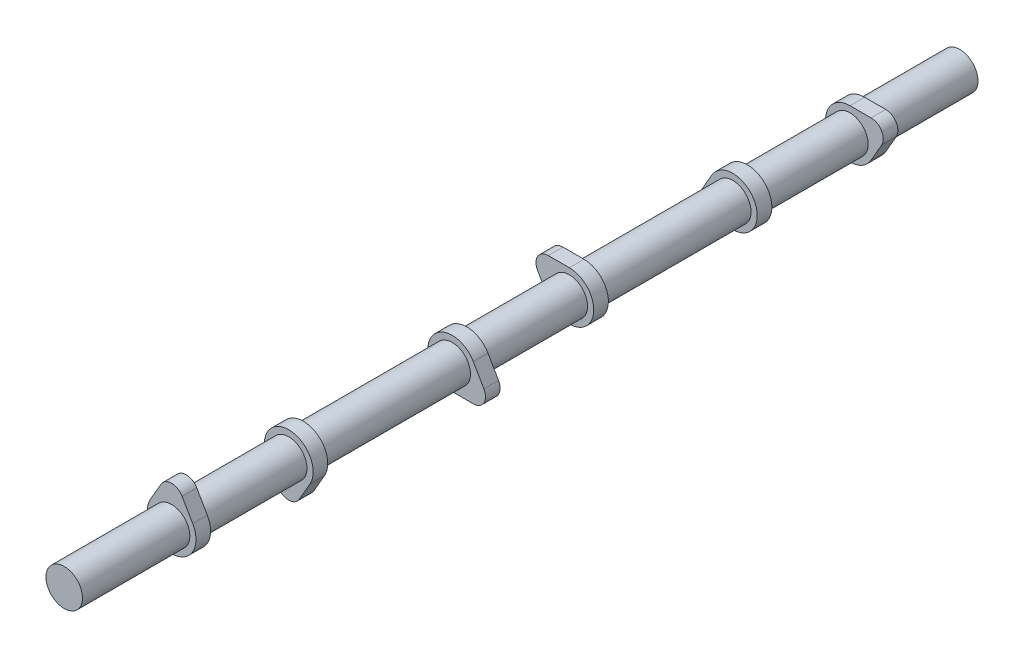
ISO-10303-21;
HEADER;
FILE_DESCRIPTION(('STEP AP214'),'2;1');
FILE_NAME('part.step','',(''),(''),'','','');
FILE_SCHEMA(('AUTOMOTIVE_DESIGN { 1 0 10303 214 1 1 1 1 }'));
ENDSEC;
DATA;
#1=APPLICATION_CONTEXT('core data for automotive mechanical design processes');
#2=APPLICATION_PROTOCOL_DEFINITION('international standard','automotive_design',2000,#1);
#3=PRODUCT_CONTEXT('',#1,'mechanical');
#4=PRODUCT('Part','Part','',(#3));
#5=PRODUCT_RELATED_PRODUCT_CATEGORY('part','',(#4));
#6=PRODUCT_DEFINITION_FORMATION('','',#4);
#7=PRODUCT_DEFINITION_CONTEXT('part definition',#1,'design');
#8=PRODUCT_DEFINITION('design','',#6,#7);
#9=PRODUCT_DEFINITION_SHAPE('','',#8);
#10=(LENGTH_UNIT() NAMED_UNIT(*) SI_UNIT(.MILLI.,.METRE.));
#11=(NAMED_UNIT(*) PLANE_ANGLE_UNIT() SI_UNIT($,.RADIAN.));
#12=(NAMED_UNIT(*) SI_UNIT($,.STERADIAN.) SOLID_ANGLE_UNIT());
#13=UNCERTAINTY_MEASURE_WITH_UNIT(LENGTH_MEASURE(1.E-05),#10,'distance_accuracy_value','');
#14=(GEOMETRIC_REPRESENTATION_CONTEXT(3) GLOBAL_UNCERTAINTY_ASSIGNED_CONTEXT((#13)) GLOBAL_UNIT_ASSIGNED_CONTEXT((#10,
#11,#12)) REPRESENTATION_CONTEXT('',''));
#15=CARTESIAN_POINT('',(0.,0.,0.));
#16=DIRECTION('',(0.,0.,1.));
#17=DIRECTION('',(1.,0.,0.));
#18=AXIS2_PLACEMENT_3D('',#15,#16,#17);
#19=CARTESIAN_POINT('',(0.,0.,-7.62));
#20=DIRECTION('',(0.,0.,1.));
#21=DIRECTION('',(1.,0.,0.));
#22=AXIS2_PLACEMENT_3D('',#19,#20,#21);
#23=CYLINDRICAL_SURFACE('',#22,12.7);
#24=CARTESIAN_POINT('',(0.,0.,0.));
#25=DIRECTION('',(0.,0.,1.));
#26=DIRECTION('',(1.,0.,0.));
#27=AXIS2_PLACEMENT_3D('',#24,#25,#26);
#28=CIRCLE('',#27,12.7);
#29=CARTESIAN_POINT('',(-10.9985226280624,6.35,0.));
#30=VERTEX_POINT('',#29);
#31=CARTESIAN_POINT('',(10.9985226280624,6.35,0.));
#32=VERTEX_POINT('',#31);
#33=EDGE_CURVE('E452',#30,#32,#28,.T.);
#34=ORIENTED_EDGE('',*,*,#33,.F.);
#35=DIRECTION('',(0.,0.,1.));
#36=VECTOR('',#35,1.);
#37=CARTESIAN_POINT('',(-10.9985226280624,6.35,-7.62));
#38=LINE('',#37,#36);
#39=CARTESIAN_POINT('',(-10.9985226280624,6.35,-7.62));
#40=VERTEX_POINT('',#39);
#41=EDGE_CURVE('E57',#40,#30,#38,.T.);
#42=ORIENTED_EDGE('',*,*,#41,.F.);
#43=CARTESIAN_POINT('',(0.,0.,-7.62));
#44=DIRECTION('',(0.,0.,1.));
#45=DIRECTION('',(1.,0.,0.));
#46=AXIS2_PLACEMENT_3D('',#43,#44,#45);
#47=CIRCLE('',#46,12.7);
#48=CARTESIAN_POINT('',(10.9985226280624,6.35,-7.62));
#49=VERTEX_POINT('',#48);
#50=EDGE_CURVE('E453',#40,#49,#47,.T.);
#51=ORIENTED_EDGE('',*,*,#50,.T.);
#52=DIRECTION('',(0.,0.,1.));
#53=VECTOR('',#52,1.);
#54=CARTESIAN_POINT('',(10.9985226280624,6.35,-7.62));
#55=LINE('',#54,#53);
#56=EDGE_CURVE('E86',#49,#32,#55,.T.);
#57=ORIENTED_EDGE('',*,*,#56,.T.);
#58=EDGE_LOOP('',(#34,#42,#51,#57));
#59=FACE_BOUND('',#58,.T.);
#60=ADVANCED_FACE('F39',(#59),#23,.T.);
#61=CARTESIAN_POINT('',(-10.9985226280624,6.35,-7.62));
#62=DIRECTION('',(0.866025403784439,-0.5,0.));
#63=DIRECTION('',(0.5,0.866025403784439,0.));
#64=AXIS2_PLACEMENT_3D('',#61,#62,#63);
#65=PLANE('',#64);
#66=DIRECTION('',(0.5,0.866025403784439,0.));
#67=VECTOR('',#66,1.);
#68=CARTESIAN_POINT('',(-10.9985226280624,6.35,0.));
#69=LINE('',#68,#67);
#70=CARTESIAN_POINT('',(-5.49926131403119,15.875,0.));
#71=VERTEX_POINT('',#70);
#72=EDGE_CURVE('E457',#30,#71,#69,.T.);
#73=ORIENTED_EDGE('',*,*,#72,.T.);
#74=DIRECTION('',(0.,0.,1.));
#75=VECTOR('',#74,1.);
#76=CARTESIAN_POINT('',(-5.49926131403119,15.875,-7.62));
#77=LINE('',#76,#75);
#78=CARTESIAN_POINT('',(-5.49926131403119,15.875,-7.62));
#79=VERTEX_POINT('',#78);
#80=EDGE_CURVE('E76',#79,#71,#77,.T.);
#81=ORIENTED_EDGE('',*,*,#80,.F.);
#82=DIRECTION('',(0.5,0.866025403784439,0.));
#83=VECTOR('',#82,1.);
#84=CARTESIAN_POINT('',(-10.9985226280624,6.35,-7.62));
#85=LINE('',#84,#83);
#86=EDGE_CURVE('E463',#40,#79,#85,.T.);
#87=ORIENTED_EDGE('',*,*,#86,.F.);
#88=ORIENTED_EDGE('',*,*,#41,.T.);
#89=EDGE_LOOP('',(#73,#81,#87,#88));
#90=FACE_BOUND('',#89,.T.);
#91=ADVANCED_FACE('F557',(#90),#65,.F.);
#92=CARTESIAN_POINT('',(0.,12.7,-7.62));
#93=DIRECTION('',(0.,0.,1.));
#94=DIRECTION('',(1.,0.,0.));
#95=AXIS2_PLACEMENT_3D('',#92,#93,#94);
#96=CYLINDRICAL_SURFACE('',#95,6.35);
#97=CARTESIAN_POINT('',(0.,12.7,0.));
#98=DIRECTION('',(0.,0.,1.));
#99=DIRECTION('',(1.,0.,0.));
#100=AXIS2_PLACEMENT_3D('',#97,#98,#99);
#101=CIRCLE('',#100,6.35);
#102=CARTESIAN_POINT('',(5.49926131403119,15.875,0.));
#103=VERTEX_POINT('',#102);
#104=EDGE_CURVE('E473',#103,#71,#101,.T.);
#105=ORIENTED_EDGE('',*,*,#104,.F.);
#106=DIRECTION('',(0.,0.,1.));
#107=VECTOR('',#106,1.);
#108=CARTESIAN_POINT('',(5.49926131403119,15.875,-7.62));
#109=LINE('',#108,#107);
#110=CARTESIAN_POINT('',(5.49926131403119,15.875,-7.62));
#111=VERTEX_POINT('',#110);
#112=EDGE_CURVE('E484',#111,#103,#109,.T.);
#113=ORIENTED_EDGE('',*,*,#112,.F.);
#114=CARTESIAN_POINT('',(0.,12.7,-7.62));
#115=DIRECTION('',(0.,0.,1.));
#116=DIRECTION('',(1.,0.,0.));
#117=AXIS2_PLACEMENT_3D('',#114,#115,#116);
#118=CIRCLE('',#117,6.35);
#119=EDGE_CURVE('E460',#111,#79,#118,.T.);
#120=ORIENTED_EDGE('',*,*,#119,.T.);
#121=ORIENTED_EDGE('',*,*,#80,.T.);
#122=EDGE_LOOP('',(#105,#113,#120,#121));
#123=FACE_BOUND('',#122,.T.);
#124=ADVANCED_FACE('F561',(#123),#96,.T.);
#125=CARTESIAN_POINT('',(10.9985226280624,6.35,-7.62));
#126=DIRECTION('',(0.866025403784439,0.5,0.));
#127=DIRECTION('',(-0.5,0.866025403784439,0.));
#128=AXIS2_PLACEMENT_3D('',#125,#126,#127);
#129=PLANE('',#128);
#130=DIRECTION('',(-0.5,0.866025403784439,0.));
#131=VECTOR('',#130,1.);
#132=CARTESIAN_POINT('',(10.9985226280624,6.35,0.));
#133=LINE('',#132,#131);
#134=EDGE_CURVE('E469',#32,#103,#133,.T.);
#135=ORIENTED_EDGE('',*,*,#134,.F.);
#136=ORIENTED_EDGE('',*,*,#56,.F.);
#137=DIRECTION('',(-0.5,0.866025403784439,0.));
#138=VECTOR('',#137,1.);
#139=CARTESIAN_POINT('',(10.9985226280624,6.35,-7.62));
#140=LINE('',#139,#138);
#141=EDGE_CURVE('E456',#49,#111,#140,.T.);
#142=ORIENTED_EDGE('',*,*,#141,.T.);
#143=ORIENTED_EDGE('',*,*,#112,.T.);
#144=EDGE_LOOP('',(#135,#136,#142,#143));
#145=FACE_BOUND('',#144,.T.);
#146=ADVANCED_FACE('F569',(#145),#129,.T.);
#147=CARTESIAN_POINT('',(0.,0.,-7.62));
#148=DIRECTION('',(0.,0.,1.));
#149=DIRECTION('',(1.,0.,0.));
#150=AXIS2_PLACEMENT_3D('',#147,#148,#149);
#151=PLANE('',#150);
#152=CARTESIAN_POINT('',(0.,0.,-7.62000000000002));
#153=DIRECTION('',(0.,0.,1.));
#154=DIRECTION('',(1.,0.,0.));
#155=AXIS2_PLACEMENT_3D('',#152,#153,#154);
#156=CIRCLE('',#155,9.5);
#157=CARTESIAN_POINT('',(9.5,0.,-7.62000000000002));
#158=VERTEX_POINT('',#157);
#159=EDGE_CURVE('E444',#158,#158,#156,.T.);
#160=ORIENTED_EDGE('',*,*,#159,.T.);
#161=EDGE_LOOP('',(#160));
#162=FACE_BOUND('',#161,.T.);
#163=ORIENTED_EDGE('',*,*,#50,.F.);
#164=ORIENTED_EDGE('',*,*,#86,.T.);
#165=ORIENTED_EDGE('',*,*,#119,.F.);
#166=ORIENTED_EDGE('',*,*,#141,.F.);
#167=EDGE_LOOP('',(#163,#164,#165,#166));
#168=FACE_BOUND('',#167,.T.);
#169=ADVANCED_FACE('F568',(#162,#168),#151,.F.);
#170=CARTESIAN_POINT('',(0.,0.,0.));
#171=DIRECTION('',(0.,0.,1.));
#172=DIRECTION('',(1.,0.,0.));
#173=AXIS2_PLACEMENT_3D('',#170,#171,#172);
#174=PLANE('',#173);
#175=CARTESIAN_POINT('',(0.,0.,0.));
#176=DIRECTION('',(0.,0.,1.));
#177=DIRECTION('',(1.,0.,0.));
#178=AXIS2_PLACEMENT_3D('',#175,#176,#177);
#179=CIRCLE('',#178,9.5);
#180=CARTESIAN_POINT('',(9.5,0.,0.));
#181=VERTEX_POINT('',#180);
#182=EDGE_CURVE('E481',#181,#181,#179,.T.);
#183=ORIENTED_EDGE('',*,*,#182,.F.);
#184=EDGE_LOOP('',(#183));
#185=FACE_BOUND('',#184,.T.);
#186=ORIENTED_EDGE('',*,*,#33,.T.);
#187=ORIENTED_EDGE('',*,*,#134,.T.);
#188=ORIENTED_EDGE('',*,*,#104,.T.);
#189=ORIENTED_EDGE('',*,*,#72,.F.);
#190=EDGE_LOOP('',(#186,#187,#188,#189));
#191=FACE_BOUND('',#190,.T.);
#192=ADVANCED_FACE('F564',(#185,#191),#174,.T.);
#193=CARTESIAN_POINT('',(0.,0.,55.88));
#194=DIRECTION('',(0.,0.,1.));
#195=DIRECTION('',(1.,0.,0.));
#196=AXIS2_PLACEMENT_3D('',#193,#194,#195);
#197=PLANE('',#196);
#198=CARTESIAN_POINT('',(0.,0.,55.88));
#199=DIRECTION('',(0.,0.,1.));
#200=DIRECTION('',(1.,0.,0.));
#201=AXIS2_PLACEMENT_3D('',#198,#199,#200);
#202=CIRCLE('',#201,9.5);
#203=CARTESIAN_POINT('',(9.5,0.,55.88));
#204=VERTEX_POINT('',#203);
#205=EDGE_CURVE('E445',#204,#204,#202,.T.);
#206=ORIENTED_EDGE('',*,*,#205,.T.);
#207=EDGE_LOOP('',(#206));
#208=FACE_BOUND('',#207,.T.);
#209=ADVANCED_FACE('F580',(#208),#197,.T.);
#210=CARTESIAN_POINT('',(0.,0.,-410.21));
#211=DIRECTION('',(0.,0.,1.));
#212=DIRECTION('',(1.,0.,0.));
#213=AXIS2_PLACEMENT_3D('',#210,#211,#212);
#214=CYLINDRICAL_SURFACE('',#213,9.5);
#215=ORIENTED_EDGE('',*,*,#182,.T.);
#216=EDGE_LOOP('',(#215));
#217=FACE_BOUND('',#216,.T.);
#218=ORIENTED_EDGE('',*,*,#205,.F.);
#219=EDGE_LOOP('',(#218));
#220=FACE_BOUND('',#219,.T.);
#221=ADVANCED_FACE('F582',(#217,#220),#214,.T.);
#222=CARTESIAN_POINT('',(0.,0.,-60.96));
#223=DIRECTION('',(0.,0.,1.));
#224=DIRECTION('',(1.,0.,0.));
#225=AXIS2_PLACEMENT_3D('',#222,#223,#224);
#226=CIRCLE('',#225,9.5);
#227=CARTESIAN_POINT('',(9.5,0.,-60.96));
#228=VERTEX_POINT('',#227);
#229=EDGE_CURVE('E492',#228,#228,#226,.F.);
#230=ORIENTED_EDGE('',*,*,#229,.F.);
#231=EDGE_LOOP('',(#230));
#232=FACE_BOUND('',#231,.T.);
#233=ORIENTED_EDGE('',*,*,#159,.F.);
#234=EDGE_LOOP('',(#233));
#235=FACE_BOUND('',#234,.T.);
#236=ADVANCED_FACE('F585',(#232,#235),#214,.T.);
#237=CARTESIAN_POINT('',(0.,0.,-68.58));
#238=DIRECTION('',(0.,0.,1.));
#239=DIRECTION('',(-1.,0.,0.));
#240=AXIS2_PLACEMENT_3D('',#237,#238,#239);
#241=CYLINDRICAL_SURFACE('',#240,12.7);
#242=CARTESIAN_POINT('',(0.,0.,-60.96));
#243=DIRECTION('',(0.,0.,1.));
#244=DIRECTION('',(-1.,0.,0.));
#245=AXIS2_PLACEMENT_3D('',#242,#243,#244);
#246=CIRCLE('',#245,12.7);
#247=CARTESIAN_POINT('',(10.9985226280624,-6.34999999999992,-60.96));
#248=VERTEX_POINT('',#247);
#249=CARTESIAN_POINT('',(-10.9985226280623,-6.35000000000008,-60.96));
#250=VERTEX_POINT('',#249);
#251=EDGE_CURVE('E413',#248,#250,#246,.T.);
#252=ORIENTED_EDGE('',*,*,#251,.F.);
#253=DIRECTION('',(0.,0.,1.));
#254=VECTOR('',#253,1.);
#255=CARTESIAN_POINT('',(10.9985226280624,-6.34999999999992,-68.58));
#256=LINE('',#255,#254);
#257=CARTESIAN_POINT('',(10.9985226280624,-6.34999999999992,-68.58));
#258=VERTEX_POINT('',#257);
#259=EDGE_CURVE('E428',#258,#248,#256,.T.);
#260=ORIENTED_EDGE('',*,*,#259,.F.);
#261=CARTESIAN_POINT('',(0.,0.,-68.58));
#262=DIRECTION('',(0.,0.,1.));
#263=DIRECTION('',(-1.,0.,0.));
#264=AXIS2_PLACEMENT_3D('',#261,#262,#263);
#265=CIRCLE('',#264,12.7);
#266=CARTESIAN_POINT('',(-10.9985226280623,-6.35000000000008,-68.58));
#267=VERTEX_POINT('',#266);
#268=EDGE_CURVE('E396',#258,#267,#265,.T.);
#269=ORIENTED_EDGE('',*,*,#268,.T.);
#270=DIRECTION('',(0.,0.,1.));
#271=VECTOR('',#270,1.);
#272=CARTESIAN_POINT('',(-10.9985226280623,-6.35000000000008,-68.58));
#273=LINE('',#272,#271);
#274=EDGE_CURVE('E412',#267,#250,#273,.T.);
#275=ORIENTED_EDGE('',*,*,#274,.T.);
#276=EDGE_LOOP('',(#252,#260,#269,#275));
#277=FACE_BOUND('',#276,.T.);
#278=ADVANCED_FACE('F595',(#277),#241,.T.);
#279=CARTESIAN_POINT('',(10.9985226280624,-6.34999999999992,-68.58));
#280=DIRECTION('',(-0.866025403784442,0.499999999999994,0.));
#281=DIRECTION('',(-0.499999999999994,-0.866025403784442,0.));
#282=AXIS2_PLACEMENT_3D('',#279,#280,#281);
#283=PLANE('',#282);
#284=DIRECTION('',(-0.499999999999994,-0.866025403784442,0.));
#285=VECTOR('',#284,1.);
#286=CARTESIAN_POINT('',(10.9985226280624,-6.34999999999992,-60.96));
#287=LINE('',#286,#285);
#288=CARTESIAN_POINT('',(5.4992613140313,-15.875,-60.96));
#289=VERTEX_POINT('',#288);
#290=EDGE_CURVE('E401',#248,#289,#287,.T.);
#291=ORIENTED_EDGE('',*,*,#290,.T.);
#292=DIRECTION('',(0.,0.,1.));
#293=VECTOR('',#292,1.);
#294=CARTESIAN_POINT('',(5.4992613140313,-15.875,-68.58));
#295=LINE('',#294,#293);
#296=CARTESIAN_POINT('',(5.4992613140313,-15.875,-68.58));
#297=VERTEX_POINT('',#296);
#298=EDGE_CURVE('E432',#297,#289,#295,.T.);
#299=ORIENTED_EDGE('',*,*,#298,.F.);
#300=DIRECTION('',(-0.499999999999994,-0.866025403784442,0.));
#301=VECTOR('',#300,1.);
#302=CARTESIAN_POINT('',(10.9985226280624,-6.34999999999992,-68.58));
#303=LINE('',#302,#301);
#304=EDGE_CURVE('E409',#258,#297,#303,.T.);
#305=ORIENTED_EDGE('',*,*,#304,.F.);
#306=ORIENTED_EDGE('',*,*,#259,.T.);
#307=EDGE_LOOP('',(#291,#299,#305,#306));
#308=FACE_BOUND('',#307,.T.);
#309=ADVANCED_FACE('F598',(#308),#283,.F.);
#310=CARTESIAN_POINT('',(0.,-12.7,-68.58));
#311=DIRECTION('',(0.,0.,1.));
#312=DIRECTION('',(-1.,0.,0.));
#313=AXIS2_PLACEMENT_3D('',#310,#311,#312);
#314=CYLINDRICAL_SURFACE('',#313,6.35);
#315=CARTESIAN_POINT('',(0.,-12.7,-60.96));
#316=DIRECTION('',(0.,0.,1.));
#317=DIRECTION('',(-1.,0.,0.));
#318=AXIS2_PLACEMENT_3D('',#315,#316,#317);
#319=CIRCLE('',#318,6.35);
#320=CARTESIAN_POINT('',(-5.49926131403107,-15.875,-60.96));
#321=VERTEX_POINT('',#320);
#322=EDGE_CURVE('E421',#321,#289,#319,.T.);
#323=ORIENTED_EDGE('',*,*,#322,.F.);
#324=DIRECTION('',(0.,0.,1.));
#325=VECTOR('',#324,1.);
#326=CARTESIAN_POINT('',(-5.49926131403107,-15.875,-68.58));
#327=LINE('',#326,#325);
#328=CARTESIAN_POINT('',(-5.49926131403107,-15.875,-68.58));
#329=VERTEX_POINT('',#328);
#330=EDGE_CURVE('E435',#329,#321,#327,.T.);
#331=ORIENTED_EDGE('',*,*,#330,.F.);
#332=CARTESIAN_POINT('',(0.,-12.7,-68.58));
#333=DIRECTION('',(0.,0.,1.));
#334=DIRECTION('',(-1.,0.,0.));
#335=AXIS2_PLACEMENT_3D('',#332,#333,#334);
#336=CIRCLE('',#335,6.35);
#337=EDGE_CURVE('E405',#329,#297,#336,.T.);
#338=ORIENTED_EDGE('',*,*,#337,.T.);
#339=ORIENTED_EDGE('',*,*,#298,.T.);
#340=EDGE_LOOP('',(#323,#331,#338,#339));
#341=FACE_BOUND('',#340,.T.);
#342=ADVANCED_FACE('F604',(#341),#314,.T.);
#343=CARTESIAN_POINT('',(-10.9985226280623,-6.35000000000008,-68.58));
#344=DIRECTION('',(-0.866025403784435,-0.500000000000006,0.));
#345=DIRECTION('',(0.500000000000006,-0.866025403784435,0.));
#346=AXIS2_PLACEMENT_3D('',#343,#344,#345);
#347=PLANE('',#346);
#348=DIRECTION('',(0.500000000000006,-0.866025403784435,0.));
#349=VECTOR('',#348,1.);
#350=CARTESIAN_POINT('',(-10.9985226280623,-6.35000000000008,-60.96));
#351=LINE('',#350,#349);
#352=EDGE_CURVE('E417',#250,#321,#351,.T.);
#353=ORIENTED_EDGE('',*,*,#352,.F.);
#354=ORIENTED_EDGE('',*,*,#274,.F.);
#355=DIRECTION('',(0.500000000000006,-0.866025403784435,0.));
#356=VECTOR('',#355,1.);
#357=CARTESIAN_POINT('',(-10.9985226280623,-6.35000000000008,-68.58));
#358=LINE('',#357,#356);
#359=EDGE_CURVE('E400',#267,#329,#358,.T.);
#360=ORIENTED_EDGE('',*,*,#359,.T.);
#361=ORIENTED_EDGE('',*,*,#330,.T.);
#362=EDGE_LOOP('',(#353,#354,#360,#361));
#363=FACE_BOUND('',#362,.T.);
#364=ADVANCED_FACE('F600',(#363),#347,.T.);
#365=CARTESIAN_POINT('',(0.,0.,-68.58));
#366=DIRECTION('',(0.,0.,1.));
#367=DIRECTION('',(-1.,0.,0.));
#368=AXIS2_PLACEMENT_3D('',#365,#366,#367);
#369=PLANE('',#368);
#370=CARTESIAN_POINT('',(0.,0.,-68.58));
#371=DIRECTION('',(0.,0.,1.));
#372=DIRECTION('',(1.,0.,0.));
#373=AXIS2_PLACEMENT_3D('',#370,#371,#372);
#374=CIRCLE('',#373,9.5);
#375=CARTESIAN_POINT('',(9.5,0.,-68.58));
#376=VERTEX_POINT('',#375);
#377=EDGE_CURVE('E431',#376,#376,#374,.F.);
#378=ORIENTED_EDGE('',*,*,#377,.F.);
#379=EDGE_LOOP('',(#378));
#380=FACE_BOUND('',#379,.T.);
#381=ORIENTED_EDGE('',*,*,#268,.F.);
#382=ORIENTED_EDGE('',*,*,#304,.T.);
#383=ORIENTED_EDGE('',*,*,#337,.F.);
#384=ORIENTED_EDGE('',*,*,#359,.F.);
#385=EDGE_LOOP('',(#381,#382,#383,#384));
#386=FACE_BOUND('',#385,.T.);
#387=ADVANCED_FACE('F603',(#380,#386),#369,.F.);
#388=CARTESIAN_POINT('',(0.,0.,-60.96));
#389=DIRECTION('',(0.,0.,1.));
#390=DIRECTION('',(-1.,0.,0.));
#391=AXIS2_PLACEMENT_3D('',#388,#389,#390);
#392=PLANE('',#391);
#393=ORIENTED_EDGE('',*,*,#229,.T.);
#394=EDGE_LOOP('',(#393));
#395=FACE_BOUND('',#394,.T.);
#396=ORIENTED_EDGE('',*,*,#251,.T.);
#397=ORIENTED_EDGE('',*,*,#352,.T.);
#398=ORIENTED_EDGE('',*,*,#322,.T.);
#399=ORIENTED_EDGE('',*,*,#290,.F.);
#400=EDGE_LOOP('',(#396,#397,#398,#399));
#401=FACE_BOUND('',#400,.T.);
#402=ADVANCED_FACE('F612',(#395,#401),#392,.T.);
#403=CARTESIAN_POINT('',(0.,0.,-146.05));
#404=DIRECTION('',(0.,0.,1.));
#405=DIRECTION('',(1.,0.,0.));
#406=AXIS2_PLACEMENT_3D('',#403,#404,#405);
#407=CIRCLE('',#406,9.5);
#408=CARTESIAN_POINT('',(9.5,0.,-146.05));
#409=VERTEX_POINT('',#408);
#410=EDGE_CURVE('E496',#409,#409,#407,.F.);
#411=ORIENTED_EDGE('',*,*,#410,.F.);
#412=EDGE_LOOP('',(#411));
#413=FACE_BOUND('',#412,.T.);
#414=ORIENTED_EDGE('',*,*,#377,.T.);
#415=EDGE_LOOP('',(#414));
#416=FACE_BOUND('',#415,.T.);
#417=ADVANCED_FACE('F615',(#413,#416),#214,.T.);
#418=CARTESIAN_POINT('',(0.,0.,-153.67));
#419=DIRECTION('',(0.,0.,1.));
#420=DIRECTION('',(-0.500000000000004,-0.866025403784436,0.));
#421=AXIS2_PLACEMENT_3D('',#418,#419,#420);
#422=CYLINDRICAL_SURFACE('',#421,12.7);
#423=CARTESIAN_POINT('',(0.,0.,-146.05));
#424=DIRECTION('',(0.,0.,1.));
#425=DIRECTION('',(-0.500000000000004,-0.866025403784436,0.));
#426=AXIS2_PLACEMENT_3D('',#423,#424,#425);
#427=CIRCLE('',#426,12.7);
#428=CARTESIAN_POINT('',(10.9985226280624,6.34999999999995,-146.05));
#429=VERTEX_POINT('',#428);
#430=CARTESIAN_POINT('',(0.,-12.7,-146.05));
#431=VERTEX_POINT('',#430);
#432=EDGE_CURVE('E369',#429,#431,#427,.T.);
#433=ORIENTED_EDGE('',*,*,#432,.F.);
#434=DIRECTION('',(0.,0.,1.));
#435=VECTOR('',#434,1.);
#436=CARTESIAN_POINT('',(10.9985226280624,6.34999999999995,-153.67));
#437=LINE('',#436,#435);
#438=CARTESIAN_POINT('',(10.9985226280624,6.34999999999995,-153.67));
#439=VERTEX_POINT('',#438);
#440=EDGE_CURVE('E384',#439,#429,#437,.T.);
#441=ORIENTED_EDGE('',*,*,#440,.F.);
#442=CARTESIAN_POINT('',(0.,0.,-153.67));
#443=DIRECTION('',(0.,0.,1.));
#444=DIRECTION('',(-0.500000000000004,-0.866025403784436,0.));
#445=AXIS2_PLACEMENT_3D('',#442,#443,#444);
#446=CIRCLE('',#445,12.7);
#447=CARTESIAN_POINT('',(0.,-12.7,-153.67));
#448=VERTEX_POINT('',#447);
#449=EDGE_CURVE('E352',#439,#448,#446,.T.);
#450=ORIENTED_EDGE('',*,*,#449,.T.);
#451=DIRECTION('',(0.,0.,1.));
#452=VECTOR('',#451,1.);
#453=CARTESIAN_POINT('',(0.,-12.7,-153.67));
#454=LINE('',#453,#452);
#455=EDGE_CURVE('E368',#448,#431,#454,.T.);
#456=ORIENTED_EDGE('',*,*,#455,.T.);
#457=EDGE_LOOP('',(#433,#441,#450,#456));
#458=FACE_BOUND('',#457,.T.);
#459=ADVANCED_FACE('F620',(#458),#422,.T.);
#460=CARTESIAN_POINT('',(10.9985226280624,6.34999999999995,-153.67));
#461=DIRECTION('',(-0.866025403784441,-0.499999999999996,0.));
#462=DIRECTION('',(0.499999999999996,-0.866025403784441,0.));
#463=AXIS2_PLACEMENT_3D('',#460,#461,#462);
#464=PLANE('',#463);
#465=DIRECTION('',(0.499999999999996,-0.866025403784441,0.));
#466=VECTOR('',#465,1.);
#467=CARTESIAN_POINT('',(10.9985226280624,6.34999999999995,-146.05));
#468=LINE('',#467,#466);
#469=CARTESIAN_POINT('',(16.4977839420935,-3.17500000000008,-146.05));
#470=VERTEX_POINT('',#469);
#471=EDGE_CURVE('E357',#429,#470,#468,.T.);
#472=ORIENTED_EDGE('',*,*,#471,.T.);
#473=DIRECTION('',(0.,0.,1.));
#474=VECTOR('',#473,1.);
#475=CARTESIAN_POINT('',(16.4977839420935,-3.17500000000008,-153.67));
#476=LINE('',#475,#474);
#477=CARTESIAN_POINT('',(16.4977839420935,-3.17500000000008,-153.67));
#478=VERTEX_POINT('',#477);
#479=EDGE_CURVE('E388',#478,#470,#476,.T.);
#480=ORIENTED_EDGE('',*,*,#479,.F.);
#481=DIRECTION('',(0.499999999999996,-0.866025403784441,0.));
#482=VECTOR('',#481,1.);
#483=CARTESIAN_POINT('',(10.9985226280624,6.34999999999995,-153.67));
#484=LINE('',#483,#482);
#485=EDGE_CURVE('E365',#439,#478,#484,.T.);
#486=ORIENTED_EDGE('',*,*,#485,.F.);
#487=ORIENTED_EDGE('',*,*,#440,.T.);
#488=EDGE_LOOP('',(#472,#480,#486,#487));
#489=FACE_BOUND('',#488,.T.);
#490=ADVANCED_FACE('F623',(#489),#464,.F.);
#491=CARTESIAN_POINT('',(10.9985226280623,-6.35000000000005,-153.67));
#492=DIRECTION('',(0.,0.,1.));
#493=DIRECTION('',(-0.500000000000004,-0.866025403784436,0.));
#494=AXIS2_PLACEMENT_3D('',#491,#492,#493);
#495=CYLINDRICAL_SURFACE('',#494,6.35);
#496=CARTESIAN_POINT('',(10.9985226280623,-6.35000000000005,-146.05));
#497=DIRECTION('',(0.,0.,1.));
#498=DIRECTION('',(-0.500000000000004,-0.866025403784436,0.));
#499=AXIS2_PLACEMENT_3D('',#496,#497,#498);
#500=CIRCLE('',#499,6.35);
#501=CARTESIAN_POINT('',(10.9985226280623,-12.7000000000001,-146.05));
#502=VERTEX_POINT('',#501);
#503=EDGE_CURVE('E377',#502,#470,#500,.T.);
#504=ORIENTED_EDGE('',*,*,#503,.F.);
#505=DIRECTION('',(0.,0.,1.));
#506=VECTOR('',#505,1.);
#507=CARTESIAN_POINT('',(10.9985226280623,-12.7000000000001,-153.67));
#508=LINE('',#507,#506);
#509=CARTESIAN_POINT('',(10.9985226280623,-12.7000000000001,-153.67));
#510=VERTEX_POINT('',#509);
#511=EDGE_CURVE('E391',#510,#502,#508,.T.);
#512=ORIENTED_EDGE('',*,*,#511,.F.);
#513=CARTESIAN_POINT('',(10.9985226280623,-6.35000000000005,-153.67));
#514=DIRECTION('',(0.,0.,1.));
#515=DIRECTION('',(-0.500000000000004,-0.866025403784436,0.));
#516=AXIS2_PLACEMENT_3D('',#513,#514,#515);
#517=CIRCLE('',#516,6.35);
#518=EDGE_CURVE('E361',#510,#478,#517,.T.);
#519=ORIENTED_EDGE('',*,*,#518,.T.);
#520=ORIENTED_EDGE('',*,*,#479,.T.);
#521=EDGE_LOOP('',(#504,#512,#519,#520));
#522=FACE_BOUND('',#521,.T.);
#523=ADVANCED_FACE('F629',(#522),#495,.T.);
#524=CARTESIAN_POINT('',(0.,-12.7,-153.67));
#525=DIRECTION('',(0.,-1.,0.));
#526=DIRECTION('',(1.,0.,0.));
#527=AXIS2_PLACEMENT_3D('',#524,#525,#526);
#528=PLANE('',#527);
#529=DIRECTION('',(1.,0.,0.));
#530=VECTOR('',#529,1.);
#531=CARTESIAN_POINT('',(0.,-12.7,-146.05));
#532=LINE('',#531,#530);
#533=EDGE_CURVE('E373',#431,#502,#532,.T.);
#534=ORIENTED_EDGE('',*,*,#533,.F.);
#535=ORIENTED_EDGE('',*,*,#455,.F.);
#536=DIRECTION('',(1.,0.,0.));
#537=VECTOR('',#536,1.);
#538=CARTESIAN_POINT('',(0.,-12.7,-153.67));
#539=LINE('',#538,#537);
#540=EDGE_CURVE('E356',#448,#510,#539,.T.);
#541=ORIENTED_EDGE('',*,*,#540,.T.);
#542=ORIENTED_EDGE('',*,*,#511,.T.);
#543=EDGE_LOOP('',(#534,#535,#541,#542));
#544=FACE_BOUND('',#543,.T.);
#545=ADVANCED_FACE('F625',(#544),#528,.T.);
#546=CARTESIAN_POINT('',(0.,0.,-153.67));
#547=DIRECTION('',(0.,0.,1.));
#548=DIRECTION('',(-0.500000000000004,-0.866025403784436,0.));
#549=AXIS2_PLACEMENT_3D('',#546,#547,#548);
#550=PLANE('',#549);
#551=CARTESIAN_POINT('',(0.,0.,-153.67));
#552=DIRECTION('',(0.,0.,1.));
#553=DIRECTION('',(1.,0.,0.));
#554=AXIS2_PLACEMENT_3D('',#551,#552,#553);
#555=CIRCLE('',#554,9.5);
#556=CARTESIAN_POINT('',(9.5,0.,-153.67));
#557=VERTEX_POINT('',#556);
#558=EDGE_CURVE('E387',#557,#557,#555,.F.);
#559=ORIENTED_EDGE('',*,*,#558,.F.);
#560=EDGE_LOOP('',(#559));
#561=FACE_BOUND('',#560,.T.);
#562=ORIENTED_EDGE('',*,*,#449,.F.);
#563=ORIENTED_EDGE('',*,*,#485,.T.);
#564=ORIENTED_EDGE('',*,*,#518,.F.);
#565=ORIENTED_EDGE('',*,*,#540,.F.);
#566=EDGE_LOOP('',(#562,#563,#564,#565));
#567=FACE_BOUND('',#566,.T.);
#568=ADVANCED_FACE('F628',(#561,#567),#550,.F.);
#569=CARTESIAN_POINT('',(0.,0.,-146.05));
#570=DIRECTION('',(0.,0.,1.));
#571=DIRECTION('',(-0.500000000000004,-0.866025403784436,0.));
#572=AXIS2_PLACEMENT_3D('',#569,#570,#571);
#573=PLANE('',#572);
#574=ORIENTED_EDGE('',*,*,#410,.T.);
#575=EDGE_LOOP('',(#574));
#576=FACE_BOUND('',#575,.T.);
#577=ORIENTED_EDGE('',*,*,#432,.T.);
#578=ORIENTED_EDGE('',*,*,#533,.T.);
#579=ORIENTED_EDGE('',*,*,#503,.T.);
#580=ORIENTED_EDGE('',*,*,#471,.F.);
#581=EDGE_LOOP('',(#577,#578,#579,#580));
#582=FACE_BOUND('',#581,.T.);
#583=ADVANCED_FACE('F637',(#576,#582),#573,.T.);
#584=CARTESIAN_POINT('',(0.,0.,-207.01));
#585=DIRECTION('',(0.,0.,1.));
#586=DIRECTION('',(1.,0.,0.));
#587=AXIS2_PLACEMENT_3D('',#584,#585,#586);
#588=CIRCLE('',#587,9.5);
#589=CARTESIAN_POINT('',(9.5,0.,-207.01));
#590=VERTEX_POINT('',#589);
#591=EDGE_CURVE('E503',#590,#590,#588,.F.);
#592=ORIENTED_EDGE('',*,*,#591,.F.);
#593=EDGE_LOOP('',(#592));
#594=FACE_BOUND('',#593,.T.);
#595=ORIENTED_EDGE('',*,*,#558,.T.);
#596=EDGE_LOOP('',(#595));
#597=FACE_BOUND('',#596,.T.);
#598=ADVANCED_FACE('F640',(#594,#597),#214,.T.);
#599=CARTESIAN_POINT('',(0.,0.,-214.63));
#600=DIRECTION('',(0.,0.,1.));
#601=DIRECTION('',(0.499999999999998,0.86602540378444,0.));
#602=AXIS2_PLACEMENT_3D('',#599,#600,#601);
#603=CYLINDRICAL_SURFACE('',#602,12.7);
#604=CARTESIAN_POINT('',(0.,0.,-207.01));
#605=DIRECTION('',(0.,0.,1.));
#606=DIRECTION('',(0.499999999999998,0.86602540378444,0.));
#607=AXIS2_PLACEMENT_3D('',#604,#605,#606);
#608=CIRCLE('',#607,12.7);
#609=CARTESIAN_POINT('',(-10.9985226280624,-6.35000000000003,-207.01));
#610=VERTEX_POINT('',#609);
#611=CARTESIAN_POINT('',(0.,12.7,-207.01));
#612=VERTEX_POINT('',#611);
#613=EDGE_CURVE('E325',#610,#612,#608,.T.);
#614=ORIENTED_EDGE('',*,*,#613,.F.);
#615=DIRECTION('',(0.,0.,1.));
#616=VECTOR('',#615,1.);
#617=CARTESIAN_POINT('',(-10.9985226280624,-6.35000000000003,-214.63));
#618=LINE('',#617,#616);
#619=CARTESIAN_POINT('',(-10.9985226280624,-6.35000000000003,-214.63));
#620=VERTEX_POINT('',#619);
#621=EDGE_CURVE('E340',#620,#610,#618,.T.);
#622=ORIENTED_EDGE('',*,*,#621,.F.);
#623=CARTESIAN_POINT('',(0.,0.,-214.63));
#624=DIRECTION('',(0.,0.,1.));
#625=DIRECTION('',(0.499999999999998,0.86602540378444,0.));
#626=AXIS2_PLACEMENT_3D('',#623,#624,#625);
#627=CIRCLE('',#626,12.7);
#628=CARTESIAN_POINT('',(0.,12.7,-214.63));
#629=VERTEX_POINT('',#628);
#630=EDGE_CURVE('E308',#620,#629,#627,.T.);
#631=ORIENTED_EDGE('',*,*,#630,.T.);
#632=DIRECTION('',(0.,0.,1.));
#633=VECTOR('',#632,1.);
#634=CARTESIAN_POINT('',(0.,12.7,-214.63));
#635=LINE('',#634,#633);
#636=EDGE_CURVE('E324',#629,#612,#635,.T.);
#637=ORIENTED_EDGE('',*,*,#636,.T.);
#638=EDGE_LOOP('',(#614,#622,#631,#637));
#639=FACE_BOUND('',#638,.T.);
#640=ADVANCED_FACE('F645',(#639),#603,.T.);
#641=CARTESIAN_POINT('',(-10.9985226280624,-6.35000000000003,-214.63));
#642=DIRECTION('',(0.866025403784438,0.500000000000002,0.));
#643=DIRECTION('',(-0.500000000000002,0.866025403784438,0.));
#644=AXIS2_PLACEMENT_3D('',#641,#642,#643);
#645=PLANE('',#644);
#646=DIRECTION('',(-0.500000000000002,0.866025403784438,0.));
#647=VECTOR('',#646,1.);
#648=CARTESIAN_POINT('',(-10.9985226280624,-6.35000000000003,-207.01));
#649=LINE('',#648,#647);
#650=CARTESIAN_POINT('',(-16.4977839420936,3.17499999999996,-207.01));
#651=VERTEX_POINT('',#650);
#652=EDGE_CURVE('E313',#610,#651,#649,.T.);
#653=ORIENTED_EDGE('',*,*,#652,.T.);
#654=DIRECTION('',(0.,0.,1.));
#655=VECTOR('',#654,1.);
#656=CARTESIAN_POINT('',(-16.4977839420936,3.17499999999996,-214.63));
#657=LINE('',#656,#655);
#658=CARTESIAN_POINT('',(-16.4977839420936,3.17499999999996,-214.63));
#659=VERTEX_POINT('',#658);
#660=EDGE_CURVE('E344',#659,#651,#657,.T.);
#661=ORIENTED_EDGE('',*,*,#660,.F.);
#662=DIRECTION('',(-0.500000000000002,0.866025403784438,0.));
#663=VECTOR('',#662,1.);
#664=CARTESIAN_POINT('',(-10.9985226280624,-6.35000000000003,-214.63));
#665=LINE('',#664,#663);
#666=EDGE_CURVE('E321',#620,#659,#665,.T.);
#667=ORIENTED_EDGE('',*,*,#666,.F.);
#668=ORIENTED_EDGE('',*,*,#621,.T.);
#669=EDGE_LOOP('',(#653,#661,#667,#668));
#670=FACE_BOUND('',#669,.T.);
#671=ADVANCED_FACE('F648',(#670),#645,.F.);
#672=CARTESIAN_POINT('',(-10.9985226280624,6.34999999999997,-214.63));
#673=DIRECTION('',(0.,0.,1.));
#674=DIRECTION('',(0.499999999999998,0.86602540378444,0.));
#675=AXIS2_PLACEMENT_3D('',#672,#673,#674);
#676=CYLINDRICAL_SURFACE('',#675,6.35);
#677=CARTESIAN_POINT('',(-10.9985226280624,6.34999999999997,-207.01));
#678=DIRECTION('',(0.,0.,1.));
#679=DIRECTION('',(0.499999999999998,0.86602540378444,0.));
#680=AXIS2_PLACEMENT_3D('',#677,#678,#679);
#681=CIRCLE('',#680,6.35);
#682=CARTESIAN_POINT('',(-10.9985226280624,12.7,-207.01));
#683=VERTEX_POINT('',#682);
#684=EDGE_CURVE('E333',#683,#651,#681,.T.);
#685=ORIENTED_EDGE('',*,*,#684,.F.);
#686=DIRECTION('',(0.,0.,1.));
#687=VECTOR('',#686,1.);
#688=CARTESIAN_POINT('',(-10.9985226280624,12.7,-214.63));
#689=LINE('',#688,#687);
#690=CARTESIAN_POINT('',(-10.9985226280624,12.7,-214.63));
#691=VERTEX_POINT('',#690);
#692=EDGE_CURVE('E347',#691,#683,#689,.T.);
#693=ORIENTED_EDGE('',*,*,#692,.F.);
#694=CARTESIAN_POINT('',(-10.9985226280624,6.34999999999997,-214.63));
#695=DIRECTION('',(0.,0.,1.));
#696=DIRECTION('',(0.499999999999998,0.86602540378444,0.));
#697=AXIS2_PLACEMENT_3D('',#694,#695,#696);
#698=CIRCLE('',#697,6.35);
#699=EDGE_CURVE('E317',#691,#659,#698,.T.);
#700=ORIENTED_EDGE('',*,*,#699,.T.);
#701=ORIENTED_EDGE('',*,*,#660,.T.);
#702=EDGE_LOOP('',(#685,#693,#700,#701));
#703=FACE_BOUND('',#702,.T.);
#704=ADVANCED_FACE('F654',(#703),#676,.T.);
#705=CARTESIAN_POINT('',(0.,12.7,-214.63));
#706=DIRECTION('',(0.,1.,0.));
#707=DIRECTION('',(-1.,0.,0.));
#708=AXIS2_PLACEMENT_3D('',#705,#706,#707);
#709=PLANE('',#708);
#710=DIRECTION('',(-1.,0.,0.));
#711=VECTOR('',#710,1.);
#712=CARTESIAN_POINT('',(0.,12.7,-207.01));
#713=LINE('',#712,#711);
#714=EDGE_CURVE('E329',#612,#683,#713,.T.);
#715=ORIENTED_EDGE('',*,*,#714,.F.);
#716=ORIENTED_EDGE('',*,*,#636,.F.);
#717=DIRECTION('',(-1.,0.,0.));
#718=VECTOR('',#717,1.);
#719=CARTESIAN_POINT('',(0.,12.7,-214.63));
#720=LINE('',#719,#718);
#721=EDGE_CURVE('E312',#629,#691,#720,.T.);
#722=ORIENTED_EDGE('',*,*,#721,.T.);
#723=ORIENTED_EDGE('',*,*,#692,.T.);
#724=EDGE_LOOP('',(#715,#716,#722,#723));
#725=FACE_BOUND('',#724,.T.);
#726=ADVANCED_FACE('F650',(#725),#709,.T.);
#727=CARTESIAN_POINT('',(0.,0.,-214.63));
#728=DIRECTION('',(0.,0.,1.));
#729=DIRECTION('',(0.499999999999998,0.86602540378444,0.));
#730=AXIS2_PLACEMENT_3D('',#727,#728,#729);
#731=PLANE('',#730);
#732=CARTESIAN_POINT('',(0.,0.,-214.63));
#733=DIRECTION('',(0.,0.,1.));
#734=DIRECTION('',(1.,0.,0.));
#735=AXIS2_PLACEMENT_3D('',#732,#733,#734);
#736=CIRCLE('',#735,9.5);
#737=CARTESIAN_POINT('',(9.5,0.,-214.63));
#738=VERTEX_POINT('',#737);
#739=EDGE_CURVE('E343',#738,#738,#736,.F.);
#740=ORIENTED_EDGE('',*,*,#739,.F.);
#741=EDGE_LOOP('',(#740));
#742=FACE_BOUND('',#741,.T.);
#743=ORIENTED_EDGE('',*,*,#630,.F.);
#744=ORIENTED_EDGE('',*,*,#666,.T.);
#745=ORIENTED_EDGE('',*,*,#699,.F.);
#746=ORIENTED_EDGE('',*,*,#721,.F.);
#747=EDGE_LOOP('',(#743,#744,#745,#746));
#748=FACE_BOUND('',#747,.T.);
#749=ADVANCED_FACE('F653',(#742,#748),#731,.F.);
#750=CARTESIAN_POINT('',(0.,0.,-207.01));
#751=DIRECTION('',(0.,0.,1.));
#752=DIRECTION('',(0.499999999999998,0.86602540378444,0.));
#753=AXIS2_PLACEMENT_3D('',#750,#751,#752);
#754=PLANE('',#753);
#755=ORIENTED_EDGE('',*,*,#591,.T.);
#756=EDGE_LOOP('',(#755));
#757=FACE_BOUND('',#756,.T.);
#758=ORIENTED_EDGE('',*,*,#613,.T.);
#759=ORIENTED_EDGE('',*,*,#714,.T.);
#760=ORIENTED_EDGE('',*,*,#684,.T.);
#761=ORIENTED_EDGE('',*,*,#652,.F.);
#762=EDGE_LOOP('',(#758,#759,#760,#761));
#763=FACE_BOUND('',#762,.T.);
#764=ADVANCED_FACE('F662',(#757,#763),#754,.T.);
#765=CARTESIAN_POINT('',(0.,0.,-292.1));
#766=DIRECTION('',(0.,0.,1.));
#767=DIRECTION('',(1.,0.,0.));
#768=AXIS2_PLACEMENT_3D('',#765,#766,#767);
#769=CIRCLE('',#768,9.5);
#770=CARTESIAN_POINT('',(9.5,0.,-292.1));
#771=VERTEX_POINT('',#770);
#772=EDGE_CURVE('E49',#771,#771,#769,.F.);
#773=ORIENTED_EDGE('',*,*,#772,.F.);
#774=EDGE_LOOP('',(#773));
#775=FACE_BOUND('',#774,.T.);
#776=ORIENTED_EDGE('',*,*,#739,.T.);
#777=EDGE_LOOP('',(#776));
#778=FACE_BOUND('',#777,.T.);
#779=ADVANCED_FACE('F553',(#775,#778),#214,.T.);
#780=CARTESIAN_POINT('',(0.,0.,-299.72));
#781=DIRECTION('',(0.,0.,1.));
#782=DIRECTION('',(-0.499999999999992,0.866025403784443,0.));
#783=AXIS2_PLACEMENT_3D('',#780,#781,#782);
#784=CYLINDRICAL_SURFACE('',#783,12.7);
#785=CARTESIAN_POINT('',(0.,0.,-292.1));
#786=DIRECTION('',(0.,0.,1.));
#787=DIRECTION('',(-0.499999999999992,0.866025403784443,0.));
#788=AXIS2_PLACEMENT_3D('',#785,#786,#787);
#789=CIRCLE('',#788,12.7);
#790=CARTESIAN_POINT('',(-1.17093834628434E-13,-12.7,-292.1));
#791=VERTEX_POINT('',#790);
#792=CARTESIAN_POINT('',(-10.9985226280623,6.3500000000001,-292.1));
#793=VERTEX_POINT('',#792);
#794=EDGE_CURVE('E281',#791,#793,#789,.T.);
#795=ORIENTED_EDGE('',*,*,#794,.F.);
#796=DIRECTION('',(0.,0.,1.));
#797=VECTOR('',#796,1.);
#798=CARTESIAN_POINT('',(-1.17093834628434E-13,-12.7,-299.72));
#799=LINE('',#798,#797);
#800=CARTESIAN_POINT('',(-1.17093834628434E-13,-12.7,-299.72));
#801=VERTEX_POINT('',#800);
#802=EDGE_CURVE('E296',#801,#791,#799,.T.);
#803=ORIENTED_EDGE('',*,*,#802,.F.);
#804=CARTESIAN_POINT('',(0.,0.,-299.72));
#805=DIRECTION('',(0.,0.,1.));
#806=DIRECTION('',(-0.499999999999992,0.866025403784443,0.));
#807=AXIS2_PLACEMENT_3D('',#804,#805,#806);
#808=CIRCLE('',#807,12.7);
#809=CARTESIAN_POINT('',(-10.9985226280623,6.3500000000001,-299.72));
#810=VERTEX_POINT('',#809);
#811=EDGE_CURVE('E264',#801,#810,#808,.T.);
#812=ORIENTED_EDGE('',*,*,#811,.T.);
#813=DIRECTION('',(0.,0.,1.));
#814=VECTOR('',#813,1.);
#815=CARTESIAN_POINT('',(-10.9985226280623,6.3500000000001,-299.72));
#816=LINE('',#815,#814);
#817=EDGE_CURVE('E280',#810,#793,#816,.T.);
#818=ORIENTED_EDGE('',*,*,#817,.T.);
#819=EDGE_LOOP('',(#795,#803,#812,#818));
#820=FACE_BOUND('',#819,.T.);
#821=ADVANCED_FACE('F535',(#820),#784,.T.);
#822=CARTESIAN_POINT('',(-1.17093834628434E-13,-12.7,-299.72));
#823=DIRECTION('',(0.,1.,0.));
#824=DIRECTION('',(-1.,0.,0.));
#825=AXIS2_PLACEMENT_3D('',#822,#823,#824);
#826=PLANE('',#825);
#827=DIRECTION('',(-1.,0.,0.));
#828=VECTOR('',#827,1.);
#829=CARTESIAN_POINT('',(-1.17093834628434E-13,-12.7,-292.1));
#830=LINE('',#829,#828);
#831=CARTESIAN_POINT('',(-10.9985226280625,-12.6999999999999,-292.1));
#832=VERTEX_POINT('',#831);
#833=EDGE_CURVE('E269',#791,#832,#830,.T.);
#834=ORIENTED_EDGE('',*,*,#833,.T.);
#835=DIRECTION('',(0.,0.,1.));
#836=VECTOR('',#835,1.);
#837=CARTESIAN_POINT('',(-10.9985226280625,-12.6999999999999,-299.72));
#838=LINE('',#837,#836);
#839=CARTESIAN_POINT('',(-10.9985226280625,-12.6999999999999,-299.72));
#840=VERTEX_POINT('',#839);
#841=EDGE_CURVE('E300',#840,#832,#838,.T.);
#842=ORIENTED_EDGE('',*,*,#841,.F.);
#843=DIRECTION('',(-1.,0.,0.));
#844=VECTOR('',#843,1.);
#845=CARTESIAN_POINT('',(-1.17093834628434E-13,-12.7,-299.72));
#846=LINE('',#845,#844);
#847=EDGE_CURVE('E277',#801,#840,#846,.T.);
#848=ORIENTED_EDGE('',*,*,#847,.F.);
#849=ORIENTED_EDGE('',*,*,#802,.T.);
#850=EDGE_LOOP('',(#834,#842,#848,#849));
#851=FACE_BOUND('',#850,.T.);
#852=ADVANCED_FACE('F539',(#851),#826,.F.);
#853=CARTESIAN_POINT('',(-10.9985226280624,-6.3499999999999,-299.72));
#854=DIRECTION('',(0.,0.,1.));
#855=DIRECTION('',(-0.499999999999992,0.866025403784443,0.));
#856=AXIS2_PLACEMENT_3D('',#853,#854,#855);
#857=CYLINDRICAL_SURFACE('',#856,6.35);
#858=CARTESIAN_POINT('',(-10.9985226280624,-6.3499999999999,-292.1));
#859=DIRECTION('',(0.,0.,1.));
#860=DIRECTION('',(-0.499999999999992,0.866025403784443,0.));
#861=AXIS2_PLACEMENT_3D('',#858,#859,#860);
#862=CIRCLE('',#861,6.35);
#863=CARTESIAN_POINT('',(-16.4977839420936,-3.17499999999985,-292.1));
#864=VERTEX_POINT('',#863);
#865=EDGE_CURVE('E289',#864,#832,#862,.T.);
#866=ORIENTED_EDGE('',*,*,#865,.F.);
#867=DIRECTION('',(0.,0.,1.));
#868=VECTOR('',#867,1.);
#869=CARTESIAN_POINT('',(-16.4977839420936,-3.17499999999985,-299.72));
#870=LINE('',#869,#868);
#871=CARTESIAN_POINT('',(-16.4977839420936,-3.17499999999985,-299.72));
#872=VERTEX_POINT('',#871);
#873=EDGE_CURVE('E303',#872,#864,#870,.T.);
#874=ORIENTED_EDGE('',*,*,#873,.F.);
#875=CARTESIAN_POINT('',(-10.9985226280624,-6.3499999999999,-299.72));
#876=DIRECTION('',(0.,0.,1.));
#877=DIRECTION('',(-0.499999999999992,0.866025403784443,0.));
#878=AXIS2_PLACEMENT_3D('',#875,#876,#877);
#879=CIRCLE('',#878,6.35);
#880=EDGE_CURVE('E273',#872,#840,#879,.T.);
#881=ORIENTED_EDGE('',*,*,#880,.T.);
#882=ORIENTED_EDGE('',*,*,#841,.T.);
#883=EDGE_LOOP('',(#866,#874,#881,#882));
#884=FACE_BOUND('',#883,.T.);
#885=ADVANCED_FACE('F542',(#884),#857,.T.);
#886=CARTESIAN_POINT('',(-10.9985226280623,6.3500000000001,-299.72));
#887=DIRECTION('',(-0.866025403784434,0.500000000000008,0.));
#888=DIRECTION('',(-0.500000000000008,-0.866025403784434,0.));
#889=AXIS2_PLACEMENT_3D('',#886,#887,#888);
#890=PLANE('',#889);
#891=DIRECTION('',(-0.500000000000008,-0.866025403784434,0.));
#892=VECTOR('',#891,1.);
#893=CARTESIAN_POINT('',(-10.9985226280623,6.3500000000001,-292.1));
#894=LINE('',#893,#892);
#895=EDGE_CURVE('E285',#793,#864,#894,.T.);
#896=ORIENTED_EDGE('',*,*,#895,.F.);
#897=ORIENTED_EDGE('',*,*,#817,.F.);
#898=DIRECTION('',(-0.500000000000008,-0.866025403784434,0.));
#899=VECTOR('',#898,1.);
#900=CARTESIAN_POINT('',(-10.9985226280623,6.3500000000001,-299.72));
#901=LINE('',#900,#899);
#902=EDGE_CURVE('E268',#810,#872,#901,.T.);
#903=ORIENTED_EDGE('',*,*,#902,.T.);
#904=ORIENTED_EDGE('',*,*,#873,.T.);
#905=EDGE_LOOP('',(#896,#897,#903,#904));
#906=FACE_BOUND('',#905,.T.);
#907=ADVANCED_FACE('F526',(#906),#890,.T.);
#908=CARTESIAN_POINT('',(0.,0.,-299.72));
#909=DIRECTION('',(0.,0.,1.));
#910=DIRECTION('',(-0.499999999999992,0.866025403784443,0.));
#911=AXIS2_PLACEMENT_3D('',#908,#909,#910);
#912=PLANE('',#911);
#913=CARTESIAN_POINT('',(0.,0.,-299.72));
#914=DIRECTION('',(0.,0.,1.));
#915=DIRECTION('',(1.,0.,0.));
#916=AXIS2_PLACEMENT_3D('',#913,#914,#915);
#917=CIRCLE('',#916,9.5);
#918=CARTESIAN_POINT('',(9.5,0.,-299.72));
#919=VERTEX_POINT('',#918);
#920=EDGE_CURVE('E299',#919,#919,#917,.F.);
#921=ORIENTED_EDGE('',*,*,#920,.F.);
#922=EDGE_LOOP('',(#921));
#923=FACE_BOUND('',#922,.T.);
#924=ORIENTED_EDGE('',*,*,#811,.F.);
#925=ORIENTED_EDGE('',*,*,#847,.T.);
#926=ORIENTED_EDGE('',*,*,#880,.F.);
#927=ORIENTED_EDGE('',*,*,#902,.F.);
#928=EDGE_LOOP('',(#924,#925,#926,#927));
#929=FACE_BOUND('',#928,.T.);
#930=ADVANCED_FACE('F522',(#923,#929),#912,.F.);
#931=CARTESIAN_POINT('',(0.,0.,-292.1));
#932=DIRECTION('',(0.,0.,1.));
#933=DIRECTION('',(-0.499999999999992,0.866025403784443,0.));
#934=AXIS2_PLACEMENT_3D('',#931,#932,#933);
#935=PLANE('',#934);
#936=ORIENTED_EDGE('',*,*,#772,.T.);
#937=EDGE_LOOP('',(#936));
#938=FACE_BOUND('',#937,.T.);
#939=ORIENTED_EDGE('',*,*,#794,.T.);
#940=ORIENTED_EDGE('',*,*,#895,.T.);
#941=ORIENTED_EDGE('',*,*,#865,.T.);
#942=ORIENTED_EDGE('',*,*,#833,.F.);
#943=EDGE_LOOP('',(#939,#940,#941,#942));
#944=FACE_BOUND('',#943,.T.);
#945=ADVANCED_FACE('F525',(#938,#944),#935,.T.);
#946=CARTESIAN_POINT('',(0.,0.,-353.06));
#947=DIRECTION('',(0.,0.,1.));
#948=DIRECTION('',(1.,0.,0.));
#949=AXIS2_PLACEMENT_3D('',#946,#947,#948);
#950=CIRCLE('',#949,9.5);
#951=CARTESIAN_POINT('',(9.5,0.,-353.06));
#952=VERTEX_POINT('',#951);
#953=EDGE_CURVE('E11',#952,#952,#950,.F.);
#954=ORIENTED_EDGE('',*,*,#953,.F.);
#955=EDGE_LOOP('',(#954));
#956=FACE_BOUND('',#955,.T.);
#957=ORIENTED_EDGE('',*,*,#920,.T.);
#958=EDGE_LOOP('',(#957));
#959=FACE_BOUND('',#958,.T.);
#960=ADVANCED_FACE('F520',(#956,#959),#214,.T.);
#961=CARTESIAN_POINT('',(0.,0.,-360.68));
#962=DIRECTION('',(0.,0.,1.));
#963=DIRECTION('',(0.499999999999998,-0.86602540378444,0.));
#964=AXIS2_PLACEMENT_3D('',#961,#962,#963);
#965=CYLINDRICAL_SURFACE('',#964,12.7);
#966=CARTESIAN_POINT('',(0.,0.,-353.06));
#967=DIRECTION('',(0.,0.,1.));
#968=DIRECTION('',(0.499999999999998,-0.86602540378444,0.));
#969=AXIS2_PLACEMENT_3D('',#966,#967,#968);
#970=CIRCLE('',#969,12.7);
#971=CARTESIAN_POINT('',(0.,12.7,-353.06));
#972=VERTEX_POINT('',#971);
#973=CARTESIAN_POINT('',(10.9985226280624,-6.35000000000002,-353.06));
#974=VERTEX_POINT('',#973);
#975=EDGE_CURVE('E249',#972,#974,#970,.T.);
#976=ORIENTED_EDGE('',*,*,#975,.F.);
#977=DIRECTION('',(0.,0.,1.));
#978=VECTOR('',#977,1.);
#979=CARTESIAN_POINT('',(0.,12.7,-360.68));
#980=LINE('',#979,#978);
#981=CARTESIAN_POINT('',(0.,12.7,-360.68));
#982=VERTEX_POINT('',#981);
#983=EDGE_CURVE('E235',#982,#972,#980,.T.);
#984=ORIENTED_EDGE('',*,*,#983,.F.);
#985=CARTESIAN_POINT('',(0.,0.,-360.68));
#986=DIRECTION('',(0.,0.,1.));
#987=DIRECTION('',(0.499999999999998,-0.86602540378444,0.));
#988=AXIS2_PLACEMENT_3D('',#985,#986,#987);
#989=CIRCLE('',#988,12.7);
#990=CARTESIAN_POINT('',(10.9985226280624,-6.35000000000002,-360.68));
#991=VERTEX_POINT('',#990);
#992=EDGE_CURVE('E229',#982,#991,#989,.T.);
#993=ORIENTED_EDGE('',*,*,#992,.T.);
#994=DIRECTION('',(0.,0.,1.));
#995=VECTOR('',#994,1.);
#996=CARTESIAN_POINT('',(10.9985226280624,-6.35000000000002,-360.68));
#997=LINE('',#996,#995);
#998=EDGE_CURVE('E211',#991,#974,#997,.T.);
#999=ORIENTED_EDGE('',*,*,#998,.T.);
#1000=EDGE_LOOP('',(#976,#984,#993,#999));
#1001=FACE_BOUND('',#1000,.T.);
#1002=ADVANCED_FACE('F234',(#1001),#965,.T.);
#1003=CARTESIAN_POINT('',(0.,12.7,-360.68));
#1004=DIRECTION('',(0.,-1.,0.));
#1005=DIRECTION('',(1.,0.,0.));
#1006=AXIS2_PLACEMENT_3D('',#1003,#1004,#1005);
#1007=PLANE('',#1006);
#1008=DIRECTION('',(1.,0.,0.));
#1009=VECTOR('',#1008,1.);
#1010=CARTESIAN_POINT('',(0.,12.7,-353.06));
#1011=LINE('',#1010,#1009);
#1012=CARTESIAN_POINT('',(10.9985226280624,12.7,-353.06));
#1013=VERTEX_POINT('',#1012);
#1014=EDGE_CURVE('E238',#972,#1013,#1011,.T.);
#1015=ORIENTED_EDGE('',*,*,#1014,.T.);
#1016=DIRECTION('',(0.,0.,1.));
#1017=VECTOR('',#1016,1.);
#1018=CARTESIAN_POINT('',(10.9985226280624,12.7,-360.68));
#1019=LINE('',#1018,#1017);
#1020=CARTESIAN_POINT('',(10.9985226280624,12.7,-360.68));
#1021=VERTEX_POINT('',#1020);
#1022=EDGE_CURVE('E259',#1021,#1013,#1019,.T.);
#1023=ORIENTED_EDGE('',*,*,#1022,.F.);
#1024=DIRECTION('',(1.,0.,0.));
#1025=VECTOR('',#1024,1.);
#1026=CARTESIAN_POINT('',(0.,12.7,-360.68));
#1027=LINE('',#1026,#1025);
#1028=EDGE_CURVE('E223',#982,#1021,#1027,.T.);
#1029=ORIENTED_EDGE('',*,*,#1028,.F.);
#1030=ORIENTED_EDGE('',*,*,#983,.T.);
#1031=EDGE_LOOP('',(#1015,#1023,#1029,#1030));
#1032=FACE_BOUND('',#1031,.T.);
#1033=ADVANCED_FACE('F713',(#1032),#1007,.F.);
#1034=CARTESIAN_POINT('',(10.9985226280624,6.34999999999997,-360.68));
#1035=DIRECTION('',(0.,0.,1.));
#1036=DIRECTION('',(0.499999999999998,-0.86602540378444,0.));
#1037=AXIS2_PLACEMENT_3D('',#1034,#1035,#1036);
#1038=CYLINDRICAL_SURFACE('',#1037,6.35);
#1039=CARTESIAN_POINT('',(10.9985226280624,6.34999999999997,-353.06));
#1040=DIRECTION('',(0.,0.,1.));
#1041=DIRECTION('',(0.499999999999998,-0.86602540378444,0.));
#1042=AXIS2_PLACEMENT_3D('',#1039,#1040,#1041);
#1043=CIRCLE('',#1042,6.35);
#1044=CARTESIAN_POINT('',(16.4977839420936,3.17499999999996,-353.06));
#1045=VERTEX_POINT('',#1044);
#1046=EDGE_CURVE('E242',#1045,#1013,#1043,.T.);
#1047=ORIENTED_EDGE('',*,*,#1046,.F.);
#1048=DIRECTION('',(0.,0.,1.));
#1049=VECTOR('',#1048,1.);
#1050=CARTESIAN_POINT('',(16.4977839420936,3.17499999999996,-360.68));
#1051=LINE('',#1050,#1049);
#1052=CARTESIAN_POINT('',(16.4977839420936,3.17499999999996,-360.68));
#1053=VERTEX_POINT('',#1052);
#1054=EDGE_CURVE('E222',#1053,#1045,#1051,.T.);
#1055=ORIENTED_EDGE('',*,*,#1054,.F.);
#1056=CARTESIAN_POINT('',(10.9985226280624,6.34999999999997,-360.68));
#1057=DIRECTION('',(0.,0.,1.));
#1058=DIRECTION('',(0.499999999999998,-0.86602540378444,0.));
#1059=AXIS2_PLACEMENT_3D('',#1056,#1057,#1058);
#1060=CIRCLE('',#1059,6.35);
#1061=EDGE_CURVE('E231',#1053,#1021,#1060,.T.);
#1062=ORIENTED_EDGE('',*,*,#1061,.T.);
#1063=ORIENTED_EDGE('',*,*,#1022,.T.);
#1064=EDGE_LOOP('',(#1047,#1055,#1062,#1063));
#1065=FACE_BOUND('',#1064,.T.);
#1066=ADVANCED_FACE('F722',(#1065),#1038,.T.);
#1067=CARTESIAN_POINT('',(10.9985226280624,-6.35000000000002,-360.68));
#1068=DIRECTION('',(0.866025403784437,-0.500000000000002,0.));
#1069=DIRECTION('',(0.500000000000002,0.866025403784437,0.));
#1070=AXIS2_PLACEMENT_3D('',#1067,#1068,#1069);
#1071=PLANE('',#1070);
#1072=DIRECTION('',(0.500000000000002,0.866025403784437,0.));
#1073=VECTOR('',#1072,1.);
#1074=CARTESIAN_POINT('',(10.9985226280624,-6.35000000000002,-353.06));
#1075=LINE('',#1074,#1073);
#1076=EDGE_CURVE('E216',#974,#1045,#1075,.T.);
#1077=ORIENTED_EDGE('',*,*,#1076,.F.);
#1078=ORIENTED_EDGE('',*,*,#998,.F.);
#1079=DIRECTION('',(0.500000000000002,0.866025403784437,0.));
#1080=VECTOR('',#1079,1.);
#1081=CARTESIAN_POINT('',(10.9985226280624,-6.35000000000002,-360.68));
#1082=LINE('',#1081,#1080);
#1083=EDGE_CURVE('E214',#991,#1053,#1082,.T.);
#1084=ORIENTED_EDGE('',*,*,#1083,.T.);
#1085=ORIENTED_EDGE('',*,*,#1054,.T.);
#1086=EDGE_LOOP('',(#1077,#1078,#1084,#1085));
#1087=FACE_BOUND('',#1086,.T.);
#1088=ADVANCED_FACE('F213',(#1087),#1071,.T.);
#1089=CARTESIAN_POINT('',(0.,0.,-360.68));
#1090=DIRECTION('',(0.,0.,1.));
#1091=DIRECTION('',(0.499999999999998,-0.86602540378444,0.));
#1092=AXIS2_PLACEMENT_3D('',#1089,#1090,#1091);
#1093=PLANE('',#1092);
#1094=CARTESIAN_POINT('',(0.,0.,-360.68));
#1095=DIRECTION('',(0.,0.,1.));
#1096=DIRECTION('',(1.,0.,0.));
#1097=AXIS2_PLACEMENT_3D('',#1094,#1095,#1096);
#1098=CIRCLE('',#1097,9.5);
#1099=CARTESIAN_POINT('',(9.5,0.,-360.68));
#1100=VERTEX_POINT('',#1099);
#1101=EDGE_CURVE('E42',#1100,#1100,#1098,.F.);
#1102=ORIENTED_EDGE('',*,*,#1101,.F.);
#1103=EDGE_LOOP('',(#1102));
#1104=FACE_BOUND('',#1103,.T.);
#1105=ORIENTED_EDGE('',*,*,#992,.F.);
#1106=ORIENTED_EDGE('',*,*,#1028,.T.);
#1107=ORIENTED_EDGE('',*,*,#1061,.F.);
#1108=ORIENTED_EDGE('',*,*,#1083,.F.);
#1109=EDGE_LOOP('',(#1105,#1106,#1107,#1108));
#1110=FACE_BOUND('',#1109,.T.);
#1111=ADVANCED_FACE('F228',(#1104,#1110),#1093,.F.);
#1112=CARTESIAN_POINT('',(0.,0.,-353.06));
#1113=DIRECTION('',(0.,0.,1.));
#1114=DIRECTION('',(0.499999999999998,-0.86602540378444,0.));
#1115=AXIS2_PLACEMENT_3D('',#1112,#1113,#1114);
#1116=PLANE('',#1115);
#1117=ORIENTED_EDGE('',*,*,#953,.T.);
#1118=EDGE_LOOP('',(#1117));
#1119=FACE_BOUND('',#1118,.T.);
#1120=ORIENTED_EDGE('',*,*,#975,.T.);
#1121=ORIENTED_EDGE('',*,*,#1076,.T.);
#1122=ORIENTED_EDGE('',*,*,#1046,.T.);
#1123=ORIENTED_EDGE('',*,*,#1014,.F.);
#1124=EDGE_LOOP('',(#1120,#1121,#1122,#1123));
#1125=FACE_BOUND('',#1124,.T.);
#1126=ADVANCED_FACE('F593',(#1119,#1125),#1116,.T.);
#1127=CARTESIAN_POINT('',(0.,0.,-410.21));
#1128=DIRECTION('',(0.,0.,1.));
#1129=DIRECTION('',(1.,0.,0.));
#1130=AXIS2_PLACEMENT_3D('',#1127,#1128,#1129);
#1131=PLANE('',#1130);
#1132=CARTESIAN_POINT('',(0.,0.,-410.21));
#1133=DIRECTION('',(0.,0.,1.));
#1134=DIRECTION('',(1.,0.,0.));
#1135=AXIS2_PLACEMENT_3D('',#1132,#1133,#1134);
#1136=CIRCLE('',#1135,9.5);
#1137=CARTESIAN_POINT('',(9.5,0.,-410.21));
#1138=VERTEX_POINT('',#1137);
#1139=EDGE_CURVE('E440',#1138,#1138,#1136,.T.);
#1140=ORIENTED_EDGE('',*,*,#1139,.F.);
#1141=EDGE_LOOP('',(#1140));
#1142=FACE_BOUND('',#1141,.T.);
#1143=ADVANCED_FACE('F590',(#1142),#1131,.F.);
#1144=ORIENTED_EDGE('',*,*,#1139,.T.);
#1145=EDGE_LOOP('',(#1144));
#1146=FACE_BOUND('',#1145,.T.);
#1147=ORIENTED_EDGE('',*,*,#1101,.T.);
#1148=EDGE_LOOP('',(#1147));
#1149=FACE_BOUND('',#1148,.T.);
#1150=ADVANCED_FACE('F554',(#1146,#1149),#214,.T.);
#1151=CLOSED_SHELL('',(#60,#91,#124,#146,#169,#192,#209,#221,#236,#278,#309,#342,#364,#387,#402,
#417,#459,#490,#523,#545,#568,#583,#598,#640,#671,#704,#726,#749,#764,#779,#821,#852,#885,#907,
#930,#945,#960,#1002,#1033,#1066,#1088,#1111,#1126,#1143,#1150));
#1152=MANIFOLD_SOLID_BREP('B2',#1151);
#1153=ADVANCED_BREP_SHAPE_REPRESENTATION('',(#18,#1152),#14);
#1154=SHAPE_DEFINITION_REPRESENTATION(#9,#1153);
ENDSEC;
END-ISO-10303-21;
